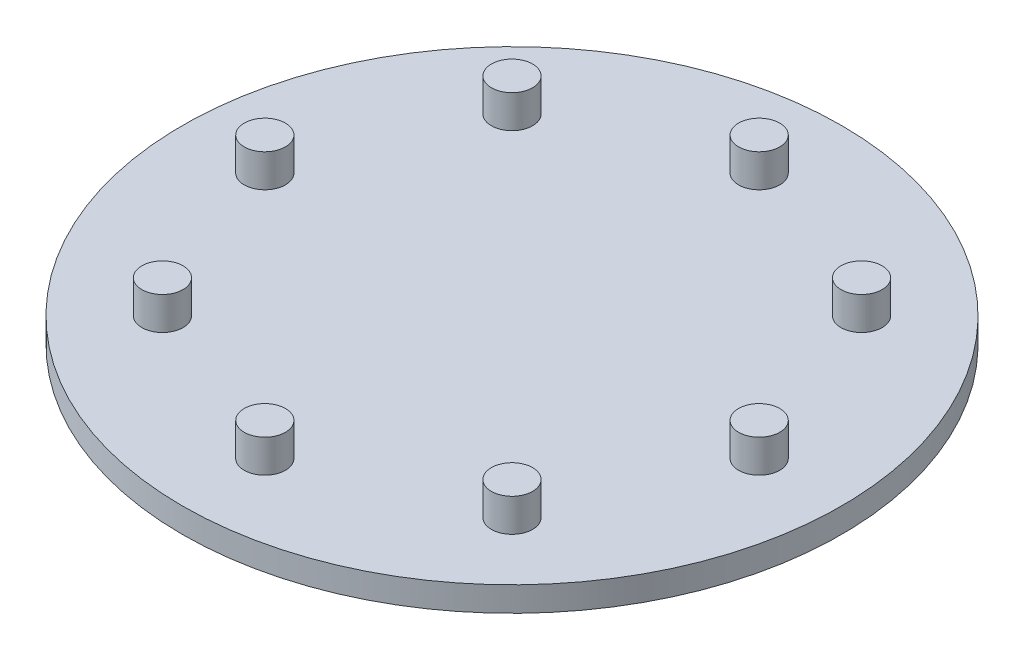
ISO-10303-21;
HEADER;
FILE_DESCRIPTION(('STEP AP214'),'2;1');
FILE_NAME('part.step','',(''),(''),'','','');
FILE_SCHEMA(('AUTOMOTIVE_DESIGN { 1 0 10303 214 1 1 1 1 }'));
ENDSEC;
DATA;
#1=APPLICATION_CONTEXT('core data for automotive mechanical design processes');
#2=APPLICATION_PROTOCOL_DEFINITION('international standard','automotive_design',2000,#1);
#3=PRODUCT_CONTEXT('',#1,'mechanical');
#4=PRODUCT('Part','Part','',(#3));
#5=PRODUCT_RELATED_PRODUCT_CATEGORY('part','',(#4));
#6=PRODUCT_DEFINITION_FORMATION('','',#4);
#7=PRODUCT_DEFINITION_CONTEXT('part definition',#1,'design');
#8=PRODUCT_DEFINITION('design','',#6,#7);
#9=PRODUCT_DEFINITION_SHAPE('','',#8);
#10=(LENGTH_UNIT() NAMED_UNIT(*) SI_UNIT(.MILLI.,.METRE.));
#11=(NAMED_UNIT(*) PLANE_ANGLE_UNIT() SI_UNIT($,.RADIAN.));
#12=(NAMED_UNIT(*) SI_UNIT($,.STERADIAN.) SOLID_ANGLE_UNIT());
#13=UNCERTAINTY_MEASURE_WITH_UNIT(LENGTH_MEASURE(1.E-05),#10,'distance_accuracy_value','');
#14=(GEOMETRIC_REPRESENTATION_CONTEXT(3) GLOBAL_UNCERTAINTY_ASSIGNED_CONTEXT((#13)) GLOBAL_UNIT_ASSIGNED_CONTEXT((#10,
#11,#12)) REPRESENTATION_CONTEXT('',''));
#15=CARTESIAN_POINT('',(0.,0.,0.));
#16=DIRECTION('',(0.,0.,1.));
#17=DIRECTION('',(1.,0.,0.));
#18=AXIS2_PLACEMENT_3D('',#15,#16,#17);
#19=CARTESIAN_POINT('',(0.,3.,0.));
#20=DIRECTION('',(0.,-1.,0.));
#21=DIRECTION('',(0.,0.,-1.));
#22=AXIS2_PLACEMENT_3D('',#19,#20,#21);
#23=CYLINDRICAL_SURFACE('',#22,40.);
#24=CARTESIAN_POINT('',(0.,3.,0.));
#25=DIRECTION('',(0.,1.,0.));
#26=DIRECTION('',(0.,0.,1.));
#27=AXIS2_PLACEMENT_3D('',#24,#25,#26);
#28=CIRCLE('',#27,40.);
#29=CARTESIAN_POINT('',(0.,3.,40.));
#30=VERTEX_POINT('',#29);
#31=EDGE_CURVE('E10',#30,#30,#28,.T.);
#32=ORIENTED_EDGE('',*,*,#31,.F.);
#33=EDGE_LOOP('',(#32));
#34=FACE_BOUND('',#33,.T.);
#35=CARTESIAN_POINT('',(0.,0.,0.));
#36=DIRECTION('',(0.,1.,0.));
#37=DIRECTION('',(0.,0.,1.));
#38=AXIS2_PLACEMENT_3D('',#35,#36,#37);
#39=CIRCLE('',#38,40.);
#40=CARTESIAN_POINT('',(0.,0.,40.));
#41=VERTEX_POINT('',#40);
#42=EDGE_CURVE('E35',#41,#41,#39,.T.);
#43=ORIENTED_EDGE('',*,*,#42,.T.);
#44=EDGE_LOOP('',(#43));
#45=FACE_BOUND('',#44,.T.);
#46=ADVANCED_FACE('F32',(#34,#45),#23,.T.);
#47=CARTESIAN_POINT('',(0.,3.,0.));
#48=DIRECTION('',(0.,1.,0.));
#49=DIRECTION('',(0.,0.,1.));
#50=AXIS2_PLACEMENT_3D('',#47,#48,#49);
#51=PLANE('',#50);
#52=CARTESIAN_POINT('',(-21.2132034355957,3.,-21.2132034355946));
#53=DIRECTION('',(0.,1.,0.));
#54=DIRECTION('',(0.,0.,1.));
#55=AXIS2_PLACEMENT_3D('',#52,#53,#54);
#56=CIRCLE('',#55,2.5000000000016);
#57=CARTESIAN_POINT('',(-21.2132034355957,3.,-18.713203435593));
#58=VERTEX_POINT('',#57);
#59=EDGE_CURVE('E86',#58,#58,#56,.T.);
#60=ORIENTED_EDGE('',*,*,#59,.F.);
#61=EDGE_LOOP('',(#60));
#62=FACE_BOUND('',#61,.T.);
#63=CARTESIAN_POINT('',(-29.9999999999974,3.,2.55611687853764E-12));
#64=DIRECTION('',(0.,1.,0.));
#65=DIRECTION('',(0.,0.,1.));
#66=AXIS2_PLACEMENT_3D('',#63,#64,#65);
#67=CIRCLE('',#66,2.50000000000349);
#68=CARTESIAN_POINT('',(-29.9999999999974,3.,2.50000000000605));
#69=VERTEX_POINT('',#68);
#70=EDGE_CURVE('E80',#69,#69,#67,.T.);
#71=ORIENTED_EDGE('',*,*,#70,.F.);
#72=EDGE_LOOP('',(#71));
#73=FACE_BOUND('',#72,.T.);
#74=CARTESIAN_POINT('',(-21.2132034355921,3.,21.2132034355982));
#75=DIRECTION('',(0.,1.,0.));
#76=DIRECTION('',(0.,0.,1.));
#77=AXIS2_PLACEMENT_3D('',#74,#75,#76);
#78=CIRCLE('',#77,2.50000000000495);
#79=CARTESIAN_POINT('',(-21.2132034355921,3.,23.7132034356032));
#80=VERTEX_POINT('',#79);
#81=EDGE_CURVE('E74',#80,#80,#78,.T.);
#82=ORIENTED_EDGE('',*,*,#81,.F.);
#83=EDGE_LOOP('',(#82));
#84=FACE_BOUND('',#83,.T.);
#85=CARTESIAN_POINT('',(5.10488587628039E-12,3.,30.));
#86=DIRECTION('',(0.,1.,0.));
#87=DIRECTION('',(0.,0.,1.));
#88=AXIS2_PLACEMENT_3D('',#85,#86,#87);
#89=CIRCLE('',#88,2.50000000000508);
#90=CARTESIAN_POINT('',(5.10488587628039E-12,3.,32.5000000000051));
#91=VERTEX_POINT('',#90);
#92=EDGE_CURVE('E68',#91,#91,#89,.T.);
#93=ORIENTED_EDGE('',*,*,#92,.F.);
#94=EDGE_LOOP('',(#93));
#95=FACE_BOUND('',#94,.T.);
#96=CARTESIAN_POINT('',(21.2132034356008,3.,21.2132034355946));
#97=DIRECTION('',(0.,1.,0.));
#98=DIRECTION('',(0.,0.,1.));
#99=AXIS2_PLACEMENT_3D('',#96,#97,#98);
#100=CIRCLE('',#99,2.50000000000379);
#101=CARTESIAN_POINT('',(21.2132034356008,3.,23.7132034355984));
#102=VERTEX_POINT('',#101);
#103=EDGE_CURVE('E62',#102,#102,#100,.T.);
#104=ORIENTED_EDGE('',*,*,#103,.F.);
#105=EDGE_LOOP('',(#104));
#106=FACE_BOUND('',#105,.T.);
#107=CARTESIAN_POINT('',(30.0000000000025,3.,-2.5524429381402E-12));
#108=DIRECTION('',(0.,1.,0.));
#109=DIRECTION('',(0.,0.,1.));
#110=AXIS2_PLACEMENT_3D('',#107,#108,#109);
#111=CIRCLE('',#110,2.5000000000018);
#112=CARTESIAN_POINT('',(30.0000000000025,3.,2.49999999999924));
#113=VERTEX_POINT('',#112);
#114=EDGE_CURVE('E56',#113,#113,#111,.T.);
#115=ORIENTED_EDGE('',*,*,#114,.F.);
#116=EDGE_LOOP('',(#115));
#117=FACE_BOUND('',#116,.T.);
#118=CARTESIAN_POINT('',(21.2132034355972,3.,-21.2132034355982));
#119=DIRECTION('',(0.,1.,0.));
#120=DIRECTION('',(0.,0.,1.));
#121=AXIS2_PLACEMENT_3D('',#118,#119,#120);
#122=CIRCLE('',#121,2.50000000000024);
#123=CARTESIAN_POINT('',(21.2132034355972,3.,-18.713203435598));
#124=VERTEX_POINT('',#123);
#125=EDGE_CURVE('E50',#124,#124,#122,.T.);
#126=ORIENTED_EDGE('',*,*,#125,.F.);
#127=EDGE_LOOP('',(#126));
#128=FACE_BOUND('',#127,.T.);
#129=CARTESIAN_POINT('',(0.,3.,-30.));
#130=DIRECTION('',(0.,1.,0.));
#131=DIRECTION('',(0.,0.,1.));
#132=AXIS2_PLACEMENT_3D('',#129,#130,#131);
#133=CIRCLE('',#132,2.5);
#134=CARTESIAN_POINT('',(0.,3.,-27.5));
#135=VERTEX_POINT('',#134);
#136=EDGE_CURVE('E44',#135,#135,#133,.T.);
#137=ORIENTED_EDGE('',*,*,#136,.F.);
#138=EDGE_LOOP('',(#137));
#139=FACE_BOUND('',#138,.T.);
#140=ORIENTED_EDGE('',*,*,#31,.T.);
#141=EDGE_LOOP('',(#140));
#142=FACE_BOUND('',#141,.T.);
#143=ADVANCED_FACE('F101',(#62,#73,#84,#95,#106,#117,#128,#139,#142),#51,.T.);
#144=CARTESIAN_POINT('',(0.,0.,0.));
#145=DIRECTION('',(0.,1.,0.));
#146=DIRECTION('',(0.,0.,1.));
#147=AXIS2_PLACEMENT_3D('',#144,#145,#146);
#148=PLANE('',#147);
#149=ORIENTED_EDGE('',*,*,#42,.F.);
#150=EDGE_LOOP('',(#149));
#151=FACE_BOUND('',#150,.T.);
#152=ADVANCED_FACE('F104',(#151),#148,.F.);
#153=CARTESIAN_POINT('',(0.,7.,-30.));
#154=DIRECTION('',(0.,-1.,0.));
#155=DIRECTION('',(0.,0.,-1.));
#156=AXIS2_PLACEMENT_3D('',#153,#154,#155);
#157=CYLINDRICAL_SURFACE('',#156,2.5);
#158=CARTESIAN_POINT('',(0.,7.,-30.));
#159=DIRECTION('',(0.,1.,0.));
#160=DIRECTION('',(0.,0.,1.));
#161=AXIS2_PLACEMENT_3D('',#158,#159,#160);
#162=CIRCLE('',#161,2.5);
#163=CARTESIAN_POINT('',(0.,7.,-27.5));
#164=VERTEX_POINT('',#163);
#165=EDGE_CURVE('E42',#164,#164,#162,.T.);
#166=ORIENTED_EDGE('',*,*,#165,.F.);
#167=EDGE_LOOP('',(#166));
#168=FACE_BOUND('',#167,.T.);
#169=ORIENTED_EDGE('',*,*,#136,.T.);
#170=EDGE_LOOP('',(#169));
#171=FACE_BOUND('',#170,.T.);
#172=ADVANCED_FACE('F120',(#168,#171),#157,.T.);
#173=CARTESIAN_POINT('',(0.,7.,-30.));
#174=DIRECTION('',(0.,1.,0.));
#175=DIRECTION('',(0.,0.,1.));
#176=AXIS2_PLACEMENT_3D('',#173,#174,#175);
#177=PLANE('',#176);
#178=ORIENTED_EDGE('',*,*,#165,.T.);
#179=EDGE_LOOP('',(#178));
#180=FACE_BOUND('',#179,.T.);
#181=ADVANCED_FACE('F122',(#180),#177,.T.);
#182=CARTESIAN_POINT('',(21.2132034355972,7.,-21.2132034355982));
#183=DIRECTION('',(0.,-1.,0.));
#184=DIRECTION('',(0.,0.,-1.));
#185=AXIS2_PLACEMENT_3D('',#182,#183,#184);
#186=CYLINDRICAL_SURFACE('',#185,2.50000000000024);
#187=CARTESIAN_POINT('',(21.2132034355972,7.,-21.2132034355982));
#188=DIRECTION('',(0.,1.,0.));
#189=DIRECTION('',(0.,0.,1.));
#190=AXIS2_PLACEMENT_3D('',#187,#188,#189);
#191=CIRCLE('',#190,2.50000000000024);
#192=CARTESIAN_POINT('',(21.2132034355972,7.,-18.713203435598));
#193=VERTEX_POINT('',#192);
#194=EDGE_CURVE('E47',#193,#193,#191,.T.);
#195=ORIENTED_EDGE('',*,*,#194,.F.);
#196=EDGE_LOOP('',(#195));
#197=FACE_BOUND('',#196,.T.);
#198=ORIENTED_EDGE('',*,*,#125,.T.);
#199=EDGE_LOOP('',(#198));
#200=FACE_BOUND('',#199,.T.);
#201=ADVANCED_FACE('F129',(#197,#200),#186,.T.);
#202=CARTESIAN_POINT('',(21.2132034355972,7.,-21.2132034355982));
#203=DIRECTION('',(0.,1.,0.));
#204=DIRECTION('',(0.,0.,1.));
#205=AXIS2_PLACEMENT_3D('',#202,#203,#204);
#206=PLANE('',#205);
#207=ORIENTED_EDGE('',*,*,#194,.T.);
#208=EDGE_LOOP('',(#207));
#209=FACE_BOUND('',#208,.T.);
#210=ADVANCED_FACE('F169',(#209),#206,.T.);
#211=CARTESIAN_POINT('',(30.0000000000025,7.,-2.5524429381402E-12));
#212=DIRECTION('',(0.,-1.,0.));
#213=DIRECTION('',(0.,0.,-1.));
#214=AXIS2_PLACEMENT_3D('',#211,#212,#213);
#215=CYLINDRICAL_SURFACE('',#214,2.5000000000018);
#216=CARTESIAN_POINT('',(30.0000000000025,7.,-2.5524429381402E-12));
#217=DIRECTION('',(0.,1.,0.));
#218=DIRECTION('',(0.,0.,1.));
#219=AXIS2_PLACEMENT_3D('',#216,#217,#218);
#220=CIRCLE('',#219,2.5000000000018);
#221=CARTESIAN_POINT('',(30.0000000000025,7.,2.49999999999924));
#222=VERTEX_POINT('',#221);
#223=EDGE_CURVE('E53',#222,#222,#220,.T.);
#224=ORIENTED_EDGE('',*,*,#223,.F.);
#225=EDGE_LOOP('',(#224));
#226=FACE_BOUND('',#225,.T.);
#227=ORIENTED_EDGE('',*,*,#114,.T.);
#228=EDGE_LOOP('',(#227));
#229=FACE_BOUND('',#228,.T.);
#230=ADVANCED_FACE('F178',(#226,#229),#215,.T.);
#231=CARTESIAN_POINT('',(30.0000000000025,7.,-2.5524429381402E-12));
#232=DIRECTION('',(0.,1.,0.));
#233=DIRECTION('',(0.,0.,1.));
#234=AXIS2_PLACEMENT_3D('',#231,#232,#233);
#235=PLANE('',#234);
#236=ORIENTED_EDGE('',*,*,#223,.T.);
#237=EDGE_LOOP('',(#236));
#238=FACE_BOUND('',#237,.T.);
#239=ADVANCED_FACE('F187',(#238),#235,.T.);
#240=CARTESIAN_POINT('',(21.2132034356008,7.,21.2132034355946));
#241=DIRECTION('',(0.,-1.,0.));
#242=DIRECTION('',(0.,0.,-1.));
#243=AXIS2_PLACEMENT_3D('',#240,#241,#242);
#244=CYLINDRICAL_SURFACE('',#243,2.50000000000379);
#245=CARTESIAN_POINT('',(21.2132034356008,7.,21.2132034355946));
#246=DIRECTION('',(0.,1.,0.));
#247=DIRECTION('',(0.,0.,1.));
#248=AXIS2_PLACEMENT_3D('',#245,#246,#247);
#249=CIRCLE('',#248,2.50000000000379);
#250=CARTESIAN_POINT('',(21.2132034356008,7.,23.7132034355984));
#251=VERTEX_POINT('',#250);
#252=EDGE_CURVE('E59',#251,#251,#249,.T.);
#253=ORIENTED_EDGE('',*,*,#252,.F.);
#254=EDGE_LOOP('',(#253));
#255=FACE_BOUND('',#254,.T.);
#256=ORIENTED_EDGE('',*,*,#103,.T.);
#257=EDGE_LOOP('',(#256));
#258=FACE_BOUND('',#257,.T.);
#259=ADVANCED_FACE('F196',(#255,#258),#244,.T.);
#260=CARTESIAN_POINT('',(21.2132034356008,7.,21.2132034355946));
#261=DIRECTION('',(0.,1.,0.));
#262=DIRECTION('',(0.,0.,1.));
#263=AXIS2_PLACEMENT_3D('',#260,#261,#262);
#264=PLANE('',#263);
#265=ORIENTED_EDGE('',*,*,#252,.T.);
#266=EDGE_LOOP('',(#265));
#267=FACE_BOUND('',#266,.T.);
#268=ADVANCED_FACE('F205',(#267),#264,.T.);
#269=CARTESIAN_POINT('',(5.10488587628039E-12,7.,30.));
#270=DIRECTION('',(0.,-1.,0.));
#271=DIRECTION('',(0.,0.,-1.));
#272=AXIS2_PLACEMENT_3D('',#269,#270,#271);
#273=CYLINDRICAL_SURFACE('',#272,2.50000000000508);
#274=CARTESIAN_POINT('',(5.10488587628039E-12,7.,30.));
#275=DIRECTION('',(0.,1.,0.));
#276=DIRECTION('',(0.,0.,1.));
#277=AXIS2_PLACEMENT_3D('',#274,#275,#276);
#278=CIRCLE('',#277,2.50000000000508);
#279=CARTESIAN_POINT('',(5.10488587628039E-12,7.,32.5000000000051));
#280=VERTEX_POINT('',#279);
#281=EDGE_CURVE('E65',#280,#280,#278,.T.);
#282=ORIENTED_EDGE('',*,*,#281,.F.);
#283=EDGE_LOOP('',(#282));
#284=FACE_BOUND('',#283,.T.);
#285=ORIENTED_EDGE('',*,*,#92,.T.);
#286=EDGE_LOOP('',(#285));
#287=FACE_BOUND('',#286,.T.);
#288=ADVANCED_FACE('F214',(#284,#287),#273,.T.);
#289=CARTESIAN_POINT('',(5.10488587628039E-12,7.,30.));
#290=DIRECTION('',(0.,1.,0.));
#291=DIRECTION('',(0.,0.,1.));
#292=AXIS2_PLACEMENT_3D('',#289,#290,#291);
#293=PLANE('',#292);
#294=ORIENTED_EDGE('',*,*,#281,.T.);
#295=EDGE_LOOP('',(#294));
#296=FACE_BOUND('',#295,.T.);
#297=ADVANCED_FACE('F223',(#296),#293,.T.);
#298=CARTESIAN_POINT('',(-21.2132034355921,7.,21.2132034355982));
#299=DIRECTION('',(0.,-1.,0.));
#300=DIRECTION('',(0.,0.,-1.));
#301=AXIS2_PLACEMENT_3D('',#298,#299,#300);
#302=CYLINDRICAL_SURFACE('',#301,2.50000000000495);
#303=CARTESIAN_POINT('',(-21.2132034355921,7.,21.2132034355982));
#304=DIRECTION('',(0.,1.,0.));
#305=DIRECTION('',(0.,0.,1.));
#306=AXIS2_PLACEMENT_3D('',#303,#304,#305);
#307=CIRCLE('',#306,2.50000000000495);
#308=CARTESIAN_POINT('',(-21.2132034355921,7.,23.7132034356032));
#309=VERTEX_POINT('',#308);
#310=EDGE_CURVE('E71',#309,#309,#307,.T.);
#311=ORIENTED_EDGE('',*,*,#310,.F.);
#312=EDGE_LOOP('',(#311));
#313=FACE_BOUND('',#312,.T.);
#314=ORIENTED_EDGE('',*,*,#81,.T.);
#315=EDGE_LOOP('',(#314));
#316=FACE_BOUND('',#315,.T.);
#317=ADVANCED_FACE('F232',(#313,#316),#302,.T.);
#318=CARTESIAN_POINT('',(-21.2132034355921,7.,21.2132034355982));
#319=DIRECTION('',(0.,1.,0.));
#320=DIRECTION('',(0.,0.,1.));
#321=AXIS2_PLACEMENT_3D('',#318,#319,#320);
#322=PLANE('',#321);
#323=ORIENTED_EDGE('',*,*,#310,.T.);
#324=EDGE_LOOP('',(#323));
#325=FACE_BOUND('',#324,.T.);
#326=ADVANCED_FACE('F241',(#325),#322,.T.);
#327=CARTESIAN_POINT('',(-29.9999999999974,7.,2.55611687853764E-12));
#328=DIRECTION('',(0.,-1.,0.));
#329=DIRECTION('',(0.,0.,-1.));
#330=AXIS2_PLACEMENT_3D('',#327,#328,#329);
#331=CYLINDRICAL_SURFACE('',#330,2.50000000000349);
#332=CARTESIAN_POINT('',(-29.9999999999974,7.,2.55611687853764E-12));
#333=DIRECTION('',(0.,1.,0.));
#334=DIRECTION('',(0.,0.,1.));
#335=AXIS2_PLACEMENT_3D('',#332,#333,#334);
#336=CIRCLE('',#335,2.50000000000349);
#337=CARTESIAN_POINT('',(-29.9999999999974,7.,2.50000000000605));
#338=VERTEX_POINT('',#337);
#339=EDGE_CURVE('E77',#338,#338,#336,.T.);
#340=ORIENTED_EDGE('',*,*,#339,.F.);
#341=EDGE_LOOP('',(#340));
#342=FACE_BOUND('',#341,.T.);
#343=ORIENTED_EDGE('',*,*,#70,.T.);
#344=EDGE_LOOP('',(#343));
#345=FACE_BOUND('',#344,.T.);
#346=ADVANCED_FACE('F250',(#342,#345),#331,.T.);
#347=CARTESIAN_POINT('',(-29.9999999999974,7.,2.55611687853764E-12));
#348=DIRECTION('',(0.,1.,0.));
#349=DIRECTION('',(0.,0.,1.));
#350=AXIS2_PLACEMENT_3D('',#347,#348,#349);
#351=PLANE('',#350);
#352=ORIENTED_EDGE('',*,*,#339,.T.);
#353=EDGE_LOOP('',(#352));
#354=FACE_BOUND('',#353,.T.);
#355=ADVANCED_FACE('F97',(#354),#351,.T.);
#356=CARTESIAN_POINT('',(-21.2132034355957,7.,-21.2132034355946));
#357=DIRECTION('',(0.,-1.,0.));
#358=DIRECTION('',(0.,0.,-1.));
#359=AXIS2_PLACEMENT_3D('',#356,#357,#358);
#360=CYLINDRICAL_SURFACE('',#359,2.5000000000016);
#361=CARTESIAN_POINT('',(-21.2132034355957,7.,-21.2132034355946));
#362=DIRECTION('',(0.,1.,0.));
#363=DIRECTION('',(0.,0.,1.));
#364=AXIS2_PLACEMENT_3D('',#361,#362,#363);
#365=CIRCLE('',#364,2.5000000000016);
#366=CARTESIAN_POINT('',(-21.2132034355957,7.,-18.713203435593));
#367=VERTEX_POINT('',#366);
#368=EDGE_CURVE('E83',#367,#367,#365,.T.);
#369=ORIENTED_EDGE('',*,*,#368,.F.);
#370=EDGE_LOOP('',(#369));
#371=FACE_BOUND('',#370,.T.);
#372=ORIENTED_EDGE('',*,*,#59,.T.);
#373=EDGE_LOOP('',(#372));
#374=FACE_BOUND('',#373,.T.);
#375=ADVANCED_FACE('F94',(#371,#374),#360,.T.);
#376=CARTESIAN_POINT('',(-21.2132034355957,7.,-21.2132034355946));
#377=DIRECTION('',(0.,1.,0.));
#378=DIRECTION('',(0.,0.,1.));
#379=AXIS2_PLACEMENT_3D('',#376,#377,#378);
#380=PLANE('',#379);
#381=ORIENTED_EDGE('',*,*,#368,.T.);
#382=EDGE_LOOP('',(#381));
#383=FACE_BOUND('',#382,.T.);
#384=ADVANCED_FACE('F92',(#383),#380,.T.);
#385=CLOSED_SHELL('',(#46,#143,#152,#172,#181,#201,#210,#230,#239,#259,#268,#288,#297,#317,#326,
#346,#355,#375,#384));
#386=MANIFOLD_SOLID_BREP('B2',#385);
#387=ADVANCED_BREP_SHAPE_REPRESENTATION('',(#18,#386),#14);
#388=SHAPE_DEFINITION_REPRESENTATION(#9,#387);
ENDSEC;
END-ISO-10303-21;
